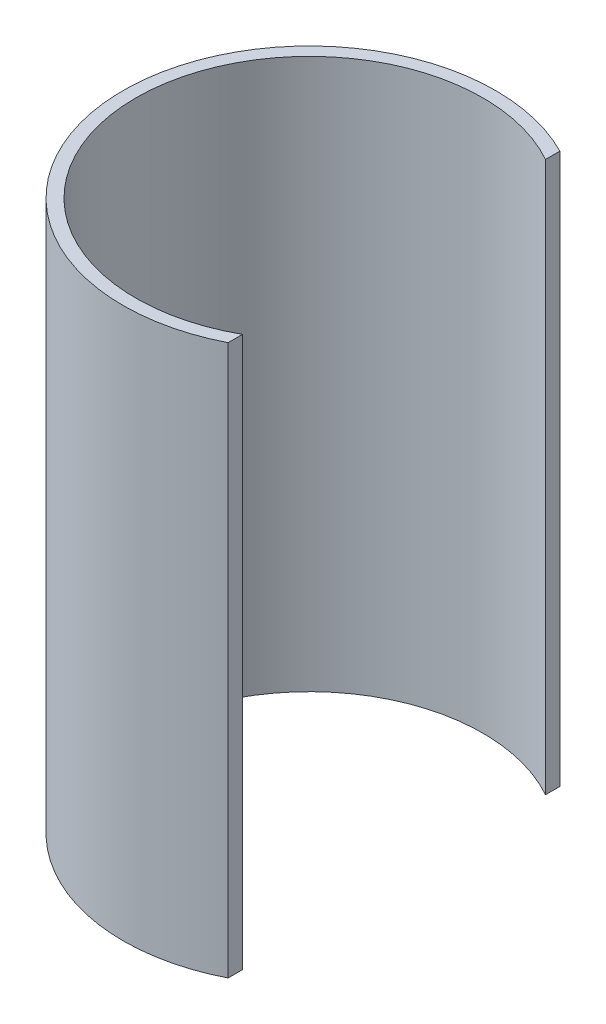
ISO-10303-21;
HEADER;
FILE_DESCRIPTION(('STEP AP214'),'2;1');
FILE_NAME('part.step','',(''),(''),'','','');
FILE_SCHEMA(('AUTOMOTIVE_DESIGN { 1 0 10303 214 1 1 1 1 }'));
ENDSEC;
DATA;
#1=APPLICATION_CONTEXT('core data for automotive mechanical design processes');
#2=APPLICATION_PROTOCOL_DEFINITION('international standard','automotive_design',2000,#1);
#3=PRODUCT_CONTEXT('',#1,'mechanical');
#4=PRODUCT('Part','Part','',(#3));
#5=PRODUCT_RELATED_PRODUCT_CATEGORY('part','',(#4));
#6=PRODUCT_DEFINITION_FORMATION('','',#4);
#7=PRODUCT_DEFINITION_CONTEXT('part definition',#1,'design');
#8=PRODUCT_DEFINITION('design','',#6,#7);
#9=PRODUCT_DEFINITION_SHAPE('','',#8);
#10=(LENGTH_UNIT() NAMED_UNIT(*) SI_UNIT(.MILLI.,.METRE.));
#11=(NAMED_UNIT(*) PLANE_ANGLE_UNIT() SI_UNIT($,.RADIAN.));
#12=(NAMED_UNIT(*) SI_UNIT($,.STERADIAN.) SOLID_ANGLE_UNIT());
#13=UNCERTAINTY_MEASURE_WITH_UNIT(LENGTH_MEASURE(1.E-05),#10,'distance_accuracy_value','');
#14=(GEOMETRIC_REPRESENTATION_CONTEXT(3) GLOBAL_UNCERTAINTY_ASSIGNED_CONTEXT((#13)) GLOBAL_UNIT_ASSIGNED_CONTEXT((#10,
#11,#12)) REPRESENTATION_CONTEXT('',''));
#15=CARTESIAN_POINT('',(0.,0.,0.));
#16=DIRECTION('',(0.,0.,1.));
#17=DIRECTION('',(1.,0.,0.));
#18=AXIS2_PLACEMENT_3D('',#15,#16,#17);
#19=CARTESIAN_POINT('',(0.,130.,0.));
#20=DIRECTION('',(0.,-1.,0.));
#21=DIRECTION('',(0.,0.,-1.));
#22=AXIS2_PLACEMENT_3D('',#19,#20,#21);
#23=CYLINDRICAL_SURFACE('',#22,41.);
#24=CARTESIAN_POINT('',(0.,0.,0.));
#25=DIRECTION('',(0.,-1.,0.));
#26=DIRECTION('',(0.,0.,1.));
#27=AXIS2_PLACEMENT_3D('',#24,#25,#26);
#28=CIRCLE('',#27,41.);
#29=CARTESIAN_POINT('',(20.,0.,35.7910603363466));
#30=VERTEX_POINT('',#29);
#31=CARTESIAN_POINT('',(20.,0.,-35.7910603363466));
#32=VERTEX_POINT('',#31);
#33=EDGE_CURVE('E113',#30,#32,#28,.T.);
#34=ORIENTED_EDGE('',*,*,#33,.T.);
#35=DIRECTION('',(0.,-1.,0.));
#36=VECTOR('',#35,1.);
#37=CARTESIAN_POINT('',(20.,130.,-35.7910603363466));
#38=LINE('',#37,#36);
#39=CARTESIAN_POINT('',(20.,130.,-35.7910603363466));
#40=VERTEX_POINT('',#39);
#41=EDGE_CURVE('E11',#40,#32,#38,.T.);
#42=ORIENTED_EDGE('',*,*,#41,.F.);
#43=CARTESIAN_POINT('',(0.,130.,0.));
#44=DIRECTION('',(0.,-1.,0.));
#45=DIRECTION('',(0.,0.,1.));
#46=AXIS2_PLACEMENT_3D('',#43,#44,#45);
#47=CIRCLE('',#46,41.);
#48=CARTESIAN_POINT('',(20.,130.,35.7910603363466));
#49=VERTEX_POINT('',#48);
#50=EDGE_CURVE('E97',#49,#40,#47,.T.);
#51=ORIENTED_EDGE('',*,*,#50,.F.);
#52=DIRECTION('',(0.,-1.,0.));
#53=VECTOR('',#52,1.);
#54=CARTESIAN_POINT('',(20.,130.,35.7910603363466));
#55=LINE('',#54,#53);
#56=EDGE_CURVE('E109',#49,#30,#55,.T.);
#57=ORIENTED_EDGE('',*,*,#56,.T.);
#58=EDGE_LOOP('',(#34,#42,#51,#57));
#59=FACE_BOUND('',#58,.T.);
#60=ADVANCED_FACE('F45',(#59),#23,.F.);
#61=CARTESIAN_POINT('',(20.,130.,-39.1918358845308));
#62=DIRECTION('',(-1.,0.,0.));
#63=DIRECTION('',(0.,0.,1.));
#64=AXIS2_PLACEMENT_3D('',#61,#62,#63);
#65=PLANE('',#64);
#66=DIRECTION('',(0.,0.,-1.));
#67=VECTOR('',#66,1.);
#68=CARTESIAN_POINT('',(20.,0.,-39.1918358845308));
#69=LINE('',#68,#67);
#70=CARTESIAN_POINT('',(20.,0.,-39.1918358845308));
#71=VERTEX_POINT('',#70);
#72=EDGE_CURVE('E102',#32,#71,#69,.T.);
#73=ORIENTED_EDGE('',*,*,#72,.T.);
#74=DIRECTION('',(0.,-1.,0.));
#75=VECTOR('',#74,1.);
#76=CARTESIAN_POINT('',(20.,130.,-39.1918358845308));
#77=LINE('',#76,#75);
#78=CARTESIAN_POINT('',(20.,130.,-39.1918358845308));
#79=VERTEX_POINT('',#78);
#80=EDGE_CURVE('E54',#79,#71,#77,.T.);
#81=ORIENTED_EDGE('',*,*,#80,.F.);
#82=DIRECTION('',(0.,0.,-1.));
#83=VECTOR('',#82,1.);
#84=CARTESIAN_POINT('',(20.,130.,-39.1918358845308));
#85=LINE('',#84,#83);
#86=EDGE_CURVE('E92',#40,#79,#85,.T.);
#87=ORIENTED_EDGE('',*,*,#86,.F.);
#88=ORIENTED_EDGE('',*,*,#41,.T.);
#89=EDGE_LOOP('',(#73,#81,#87,#88));
#90=FACE_BOUND('',#89,.T.);
#91=ADVANCED_FACE('F101',(#90),#65,.F.);
#92=CARTESIAN_POINT('',(0.,130.,0.));
#93=DIRECTION('',(0.,-1.,0.));
#94=DIRECTION('',(0.,0.,-1.));
#95=AXIS2_PLACEMENT_3D('',#92,#93,#94);
#96=CYLINDRICAL_SURFACE('',#95,44.);
#97=CARTESIAN_POINT('',(0.,0.,0.));
#98=DIRECTION('',(0.,1.,0.));
#99=DIRECTION('',(0.,0.,1.));
#100=AXIS2_PLACEMENT_3D('',#97,#98,#99);
#101=CIRCLE('',#100,44.);
#102=CARTESIAN_POINT('',(20.,0.,39.1918358845309));
#103=VERTEX_POINT('',#102);
#104=EDGE_CURVE('E79',#71,#103,#101,.T.);
#105=ORIENTED_EDGE('',*,*,#104,.T.);
#106=DIRECTION('',(0.,-1.,0.));
#107=VECTOR('',#106,1.);
#108=CARTESIAN_POINT('',(20.,130.,39.1918358845309));
#109=LINE('',#108,#107);
#110=CARTESIAN_POINT('',(20.,130.,39.1918358845309));
#111=VERTEX_POINT('',#110);
#112=EDGE_CURVE('E104',#111,#103,#109,.T.);
#113=ORIENTED_EDGE('',*,*,#112,.F.);
#114=CARTESIAN_POINT('',(0.,130.,0.));
#115=DIRECTION('',(0.,1.,0.));
#116=DIRECTION('',(0.,0.,1.));
#117=AXIS2_PLACEMENT_3D('',#114,#115,#116);
#118=CIRCLE('',#117,44.);
#119=EDGE_CURVE('E95',#79,#111,#118,.T.);
#120=ORIENTED_EDGE('',*,*,#119,.F.);
#121=ORIENTED_EDGE('',*,*,#80,.T.);
#122=EDGE_LOOP('',(#105,#113,#120,#121));
#123=FACE_BOUND('',#122,.T.);
#124=ADVANCED_FACE('F105',(#123),#96,.T.);
#125=CARTESIAN_POINT('',(20.,130.,35.7910603363466));
#126=DIRECTION('',(-1.,0.,0.));
#127=DIRECTION('',(0.,0.,1.));
#128=AXIS2_PLACEMENT_3D('',#125,#126,#127);
#129=PLANE('',#128);
#130=DIRECTION('',(0.,0.,-1.));
#131=VECTOR('',#130,1.);
#132=CARTESIAN_POINT('',(20.,0.,35.7910603363466));
#133=LINE('',#132,#131);
#134=EDGE_CURVE('E85',#103,#30,#133,.T.);
#135=ORIENTED_EDGE('',*,*,#134,.T.);
#136=ORIENTED_EDGE('',*,*,#56,.F.);
#137=DIRECTION('',(0.,0.,-1.));
#138=VECTOR('',#137,1.);
#139=CARTESIAN_POINT('',(20.,130.,35.7910603363466));
#140=LINE('',#139,#138);
#141=EDGE_CURVE('E62',#111,#49,#140,.T.);
#142=ORIENTED_EDGE('',*,*,#141,.F.);
#143=ORIENTED_EDGE('',*,*,#112,.T.);
#144=EDGE_LOOP('',(#135,#136,#142,#143));
#145=FACE_BOUND('',#144,.T.);
#146=ADVANCED_FACE('F126',(#145),#129,.F.);
#147=CARTESIAN_POINT('',(0.,130.,0.));
#148=DIRECTION('',(0.,1.,0.));
#149=DIRECTION('',(0.,0.,1.));
#150=AXIS2_PLACEMENT_3D('',#147,#148,#149);
#151=PLANE('',#150);
#152=ORIENTED_EDGE('',*,*,#50,.T.);
#153=ORIENTED_EDGE('',*,*,#86,.T.);
#154=ORIENTED_EDGE('',*,*,#119,.T.);
#155=ORIENTED_EDGE('',*,*,#141,.T.);
#156=EDGE_LOOP('',(#152,#153,#154,#155));
#157=FACE_BOUND('',#156,.T.);
#158=ADVANCED_FACE('F93',(#157),#151,.T.);
#159=CARTESIAN_POINT('',(0.,0.,0.));
#160=DIRECTION('',(0.,1.,0.));
#161=DIRECTION('',(0.,0.,1.));
#162=AXIS2_PLACEMENT_3D('',#159,#160,#161);
#163=PLANE('',#162);
#164=ORIENTED_EDGE('',*,*,#33,.F.);
#165=ORIENTED_EDGE('',*,*,#134,.F.);
#166=ORIENTED_EDGE('',*,*,#104,.F.);
#167=ORIENTED_EDGE('',*,*,#72,.F.);
#168=EDGE_LOOP('',(#164,#165,#166,#167));
#169=FACE_BOUND('',#168,.T.);
#170=ADVANCED_FACE('F129',(#169),#163,.F.);
#171=CLOSED_SHELL('',(#60,#91,#124,#146,#158,#170));
#172=MANIFOLD_SOLID_BREP('B2',#171);
#173=ADVANCED_BREP_SHAPE_REPRESENTATION('',(#18,#172),#14);
#174=SHAPE_DEFINITION_REPRESENTATION(#9,#173);
ENDSEC;
END-ISO-10303-21;
